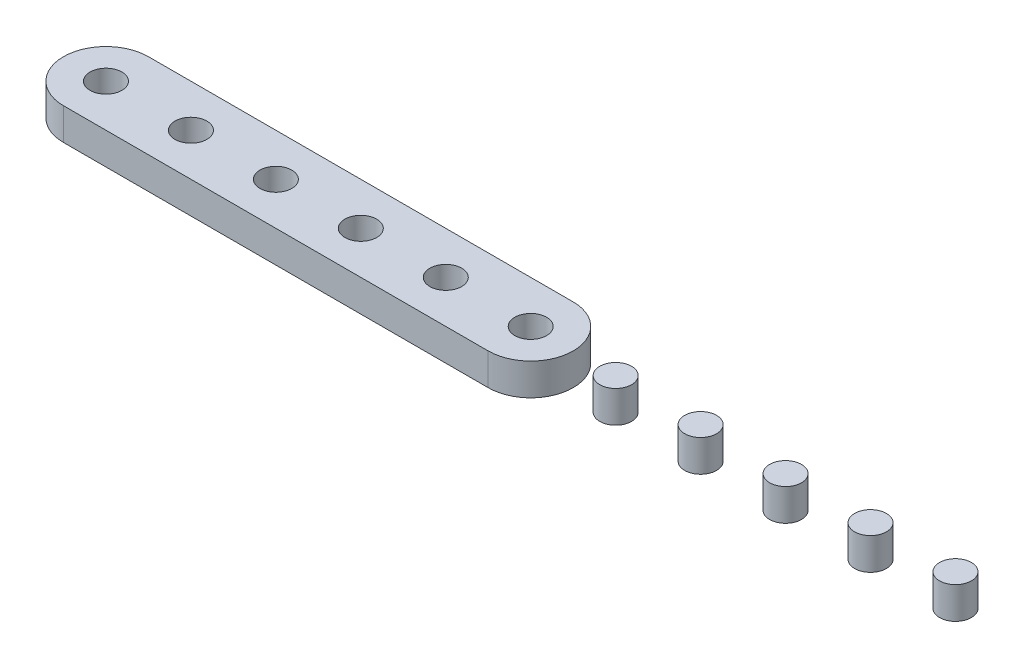
ISO-10303-21;
HEADER;
FILE_DESCRIPTION(('STEP AP214'),'2;1');
FILE_NAME('part.step','',(''),(''),'','','');
FILE_SCHEMA(('AUTOMOTIVE_DESIGN { 1 0 10303 214 1 1 1 1 }'));
ENDSEC;
DATA;
#1=APPLICATION_CONTEXT('core data for automotive mechanical design processes');
#2=APPLICATION_PROTOCOL_DEFINITION('international standard','automotive_design',2000,#1);
#3=PRODUCT_CONTEXT('',#1,'mechanical');
#4=PRODUCT('Part','Part','',(#3));
#5=PRODUCT_RELATED_PRODUCT_CATEGORY('part','',(#4));
#6=PRODUCT_DEFINITION_FORMATION('','',#4);
#7=PRODUCT_DEFINITION_CONTEXT('part definition',#1,'design');
#8=PRODUCT_DEFINITION('design','',#6,#7);
#9=PRODUCT_DEFINITION_SHAPE('','',#8);
#10=(LENGTH_UNIT() NAMED_UNIT(*) SI_UNIT(.MILLI.,.METRE.));
#11=(NAMED_UNIT(*) PLANE_ANGLE_UNIT() SI_UNIT($,.RADIAN.));
#12=(NAMED_UNIT(*) SI_UNIT($,.STERADIAN.) SOLID_ANGLE_UNIT());
#13=UNCERTAINTY_MEASURE_WITH_UNIT(LENGTH_MEASURE(1.E-05),#10,'distance_accuracy_value','');
#14=(GEOMETRIC_REPRESENTATION_CONTEXT(3) GLOBAL_UNCERTAINTY_ASSIGNED_CONTEXT((#13)) GLOBAL_UNIT_ASSIGNED_CONTEXT((#10,
#11,#12)) REPRESENTATION_CONTEXT('',''));
#15=CARTESIAN_POINT('',(0.,0.,0.));
#16=DIRECTION('',(0.,0.,1.));
#17=DIRECTION('',(1.,0.,0.));
#18=AXIS2_PLACEMENT_3D('',#15,#16,#17);
#19=CARTESIAN_POINT('',(80.,3.,0.));
#20=DIRECTION('',(0.,-1.,0.));
#21=DIRECTION('',(0.,0.,-1.));
#22=AXIS2_PLACEMENT_3D('',#19,#20,#21);
#23=CYLINDRICAL_SURFACE('',#22,1.5);
#24=CARTESIAN_POINT('',(80.,3.,0.));
#25=DIRECTION('',(0.,1.,0.));
#26=DIRECTION('',(0.,0.,1.));
#27=AXIS2_PLACEMENT_3D('',#24,#25,#26);
#28=CIRCLE('',#27,1.5);
#29=CARTESIAN_POINT('',(80.,3.,1.5));
#30=VERTEX_POINT('',#29);
#31=EDGE_CURVE('E11',#30,#30,#28,.T.);
#32=ORIENTED_EDGE('',*,*,#31,.F.);
#33=EDGE_LOOP('',(#32));
#34=FACE_BOUND('',#33,.T.);
#35=CARTESIAN_POINT('',(80.,0.,0.));
#36=DIRECTION('',(0.,1.,0.));
#37=DIRECTION('',(0.,0.,1.));
#38=AXIS2_PLACEMENT_3D('',#35,#36,#37);
#39=CIRCLE('',#38,1.5);
#40=CARTESIAN_POINT('',(80.,0.,1.5));
#41=VERTEX_POINT('',#40);
#42=EDGE_CURVE('E43',#41,#41,#39,.T.);
#43=ORIENTED_EDGE('',*,*,#42,.T.);
#44=EDGE_LOOP('',(#43));
#45=FACE_BOUND('',#44,.T.);
#46=ADVANCED_FACE('F40',(#34,#45),#23,.T.);
#47=CARTESIAN_POINT('',(80.,3.,0.));
#48=DIRECTION('',(0.,1.,0.));
#49=DIRECTION('',(0.,0.,1.));
#50=AXIS2_PLACEMENT_3D('',#47,#48,#49);
#51=PLANE('',#50);
#52=ORIENTED_EDGE('',*,*,#31,.T.);
#53=EDGE_LOOP('',(#52));
#54=FACE_BOUND('',#53,.T.);
#55=ADVANCED_FACE('F55',(#54),#51,.T.);
#56=CARTESIAN_POINT('',(80.,0.,0.));
#57=DIRECTION('',(0.,1.,0.));
#58=DIRECTION('',(0.,0.,1.));
#59=AXIS2_PLACEMENT_3D('',#56,#57,#58);
#60=PLANE('',#59);
#61=ORIENTED_EDGE('',*,*,#42,.F.);
#62=EDGE_LOOP('',(#61));
#63=FACE_BOUND('',#62,.T.);
#64=ADVANCED_FACE('F53',(#63),#60,.F.);
#65=CLOSED_SHELL('',(#46,#55,#64));
#66=MANIFOLD_SOLID_BREP('B2',#65);
#67=CARTESIAN_POINT('',(72.,3.,0.));
#68=DIRECTION('',(0.,-1.,0.));
#69=DIRECTION('',(0.,0.,-1.));
#70=AXIS2_PLACEMENT_3D('',#67,#68,#69);
#71=CYLINDRICAL_SURFACE('',#70,1.5);
#72=CARTESIAN_POINT('',(72.,3.,0.));
#73=DIRECTION('',(0.,1.,0.));
#74=DIRECTION('',(0.,0.,1.));
#75=AXIS2_PLACEMENT_3D('',#72,#73,#74);
#76=CIRCLE('',#75,1.5);
#77=CARTESIAN_POINT('',(72.,3.,1.5));
#78=VERTEX_POINT('',#77);
#79=EDGE_CURVE('E39',#78,#78,#76,.T.);
#80=ORIENTED_EDGE('',*,*,#79,.F.);
#81=EDGE_LOOP('',(#80));
#82=FACE_BOUND('',#81,.T.);
#83=CARTESIAN_POINT('',(72.,0.,0.));
#84=DIRECTION('',(0.,1.,0.));
#85=DIRECTION('',(0.,0.,1.));
#86=AXIS2_PLACEMENT_3D('',#83,#84,#85);
#87=CIRCLE('',#86,1.5);
#88=CARTESIAN_POINT('',(72.,0.,1.5));
#89=VERTEX_POINT('',#88);
#90=EDGE_CURVE('E92',#89,#89,#87,.T.);
#91=ORIENTED_EDGE('',*,*,#90,.T.);
#92=EDGE_LOOP('',(#91));
#93=FACE_BOUND('',#92,.T.);
#94=ADVANCED_FACE('F89',(#82,#93),#71,.T.);
#95=CARTESIAN_POINT('',(72.,3.,0.));
#96=DIRECTION('',(0.,1.,0.));
#97=DIRECTION('',(0.,0.,1.));
#98=AXIS2_PLACEMENT_3D('',#95,#96,#97);
#99=PLANE('',#98);
#100=ORIENTED_EDGE('',*,*,#79,.T.);
#101=EDGE_LOOP('',(#100));
#102=FACE_BOUND('',#101,.T.);
#103=ADVANCED_FACE('F104',(#102),#99,.T.);
#104=CARTESIAN_POINT('',(72.,0.,0.));
#105=DIRECTION('',(0.,1.,0.));
#106=DIRECTION('',(0.,0.,1.));
#107=AXIS2_PLACEMENT_3D('',#104,#105,#106);
#108=PLANE('',#107);
#109=ORIENTED_EDGE('',*,*,#90,.F.);
#110=EDGE_LOOP('',(#109));
#111=FACE_BOUND('',#110,.T.);
#112=ADVANCED_FACE('F102',(#111),#108,.F.);
#113=CLOSED_SHELL('',(#94,#103,#112));
#114=MANIFOLD_SOLID_BREP('B6',#113);
#115=CARTESIAN_POINT('',(64.,3.,0.));
#116=DIRECTION('',(0.,-1.,0.));
#117=DIRECTION('',(0.,0.,-1.));
#118=AXIS2_PLACEMENT_3D('',#115,#116,#117);
#119=CYLINDRICAL_SURFACE('',#118,1.5);
#120=CARTESIAN_POINT('',(64.,3.,0.));
#121=DIRECTION('',(0.,1.,0.));
#122=DIRECTION('',(0.,0.,1.));
#123=AXIS2_PLACEMENT_3D('',#120,#121,#122);
#124=CIRCLE('',#123,1.5);
#125=CARTESIAN_POINT('',(64.,3.,1.5));
#126=VERTEX_POINT('',#125);
#127=EDGE_CURVE('E88',#126,#126,#124,.T.);
#128=ORIENTED_EDGE('',*,*,#127,.F.);
#129=EDGE_LOOP('',(#128));
#130=FACE_BOUND('',#129,.T.);
#131=CARTESIAN_POINT('',(64.,0.,0.));
#132=DIRECTION('',(0.,1.,0.));
#133=DIRECTION('',(0.,0.,1.));
#134=AXIS2_PLACEMENT_3D('',#131,#132,#133);
#135=CIRCLE('',#134,1.5);
#136=CARTESIAN_POINT('',(64.,0.,1.5));
#137=VERTEX_POINT('',#136);
#138=EDGE_CURVE('E141',#137,#137,#135,.T.);
#139=ORIENTED_EDGE('',*,*,#138,.T.);
#140=EDGE_LOOP('',(#139));
#141=FACE_BOUND('',#140,.T.);
#142=ADVANCED_FACE('F138',(#130,#141),#119,.T.);
#143=CARTESIAN_POINT('',(64.,3.,0.));
#144=DIRECTION('',(0.,1.,0.));
#145=DIRECTION('',(0.,0.,1.));
#146=AXIS2_PLACEMENT_3D('',#143,#144,#145);
#147=PLANE('',#146);
#148=ORIENTED_EDGE('',*,*,#127,.T.);
#149=EDGE_LOOP('',(#148));
#150=FACE_BOUND('',#149,.T.);
#151=ADVANCED_FACE('F153',(#150),#147,.T.);
#152=CARTESIAN_POINT('',(64.,0.,0.));
#153=DIRECTION('',(0.,1.,0.));
#154=DIRECTION('',(0.,0.,1.));
#155=AXIS2_PLACEMENT_3D('',#152,#153,#154);
#156=PLANE('',#155);
#157=ORIENTED_EDGE('',*,*,#138,.F.);
#158=EDGE_LOOP('',(#157));
#159=FACE_BOUND('',#158,.T.);
#160=ADVANCED_FACE('F151',(#159),#156,.F.);
#161=CLOSED_SHELL('',(#142,#151,#160));
#162=MANIFOLD_SOLID_BREP('B34',#161);
#163=CARTESIAN_POINT('',(56.,3.,0.));
#164=DIRECTION('',(0.,-1.,0.));
#165=DIRECTION('',(0.,0.,-1.));
#166=AXIS2_PLACEMENT_3D('',#163,#164,#165);
#167=CYLINDRICAL_SURFACE('',#166,1.5);
#168=CARTESIAN_POINT('',(56.,3.,0.));
#169=DIRECTION('',(0.,1.,0.));
#170=DIRECTION('',(0.,0.,1.));
#171=AXIS2_PLACEMENT_3D('',#168,#169,#170);
#172=CIRCLE('',#171,1.5);
#173=CARTESIAN_POINT('',(56.,3.,1.5));
#174=VERTEX_POINT('',#173);
#175=EDGE_CURVE('E137',#174,#174,#172,.T.);
#176=ORIENTED_EDGE('',*,*,#175,.F.);
#177=EDGE_LOOP('',(#176));
#178=FACE_BOUND('',#177,.T.);
#179=CARTESIAN_POINT('',(56.,0.,0.));
#180=DIRECTION('',(0.,1.,0.));
#181=DIRECTION('',(0.,0.,1.));
#182=AXIS2_PLACEMENT_3D('',#179,#180,#181);
#183=CIRCLE('',#182,1.5);
#184=CARTESIAN_POINT('',(56.,0.,1.5));
#185=VERTEX_POINT('',#184);
#186=EDGE_CURVE('E190',#185,#185,#183,.T.);
#187=ORIENTED_EDGE('',*,*,#186,.T.);
#188=EDGE_LOOP('',(#187));
#189=FACE_BOUND('',#188,.T.);
#190=ADVANCED_FACE('F187',(#178,#189),#167,.T.);
#191=CARTESIAN_POINT('',(56.,3.,0.));
#192=DIRECTION('',(0.,1.,0.));
#193=DIRECTION('',(0.,0.,1.));
#194=AXIS2_PLACEMENT_3D('',#191,#192,#193);
#195=PLANE('',#194);
#196=ORIENTED_EDGE('',*,*,#175,.T.);
#197=EDGE_LOOP('',(#196));
#198=FACE_BOUND('',#197,.T.);
#199=ADVANCED_FACE('F202',(#198),#195,.T.);
#200=CARTESIAN_POINT('',(56.,0.,0.));
#201=DIRECTION('',(0.,1.,0.));
#202=DIRECTION('',(0.,0.,1.));
#203=AXIS2_PLACEMENT_3D('',#200,#201,#202);
#204=PLANE('',#203);
#205=ORIENTED_EDGE('',*,*,#186,.F.);
#206=EDGE_LOOP('',(#205));
#207=FACE_BOUND('',#206,.T.);
#208=ADVANCED_FACE('F200',(#207),#204,.F.);
#209=CLOSED_SHELL('',(#190,#199,#208));
#210=MANIFOLD_SOLID_BREP('B83',#209);
#211=CARTESIAN_POINT('',(48.,3.,0.));
#212=DIRECTION('',(0.,-1.,0.));
#213=DIRECTION('',(0.,0.,-1.));
#214=AXIS2_PLACEMENT_3D('',#211,#212,#213);
#215=CYLINDRICAL_SURFACE('',#214,1.5);
#216=CARTESIAN_POINT('',(48.,3.,0.));
#217=DIRECTION('',(0.,1.,0.));
#218=DIRECTION('',(0.,0.,1.));
#219=AXIS2_PLACEMENT_3D('',#216,#217,#218);
#220=CIRCLE('',#219,1.5);
#221=CARTESIAN_POINT('',(48.,3.,1.5));
#222=VERTEX_POINT('',#221);
#223=EDGE_CURVE('E186',#222,#222,#220,.T.);
#224=ORIENTED_EDGE('',*,*,#223,.F.);
#225=EDGE_LOOP('',(#224));
#226=FACE_BOUND('',#225,.T.);
#227=CARTESIAN_POINT('',(48.,0.,0.));
#228=DIRECTION('',(0.,1.,0.));
#229=DIRECTION('',(0.,0.,1.));
#230=AXIS2_PLACEMENT_3D('',#227,#228,#229);
#231=CIRCLE('',#230,1.5);
#232=CARTESIAN_POINT('',(48.,0.,1.5));
#233=VERTEX_POINT('',#232);
#234=EDGE_CURVE('E240',#233,#233,#231,.T.);
#235=ORIENTED_EDGE('',*,*,#234,.T.);
#236=EDGE_LOOP('',(#235));
#237=FACE_BOUND('',#236,.T.);
#238=ADVANCED_FACE('F237',(#226,#237),#215,.T.);
#239=CARTESIAN_POINT('',(48.,3.,0.));
#240=DIRECTION('',(0.,1.,0.));
#241=DIRECTION('',(0.,0.,1.));
#242=AXIS2_PLACEMENT_3D('',#239,#240,#241);
#243=PLANE('',#242);
#244=ORIENTED_EDGE('',*,*,#223,.T.);
#245=EDGE_LOOP('',(#244));
#246=FACE_BOUND('',#245,.T.);
#247=ADVANCED_FACE('F252',(#246),#243,.T.);
#248=CARTESIAN_POINT('',(48.,0.,0.));
#249=DIRECTION('',(0.,1.,0.));
#250=DIRECTION('',(0.,0.,1.));
#251=AXIS2_PLACEMENT_3D('',#248,#249,#250);
#252=PLANE('',#251);
#253=ORIENTED_EDGE('',*,*,#234,.F.);
#254=EDGE_LOOP('',(#253));
#255=FACE_BOUND('',#254,.T.);
#256=ADVANCED_FACE('F250',(#255),#252,.F.);
#257=CLOSED_SHELL('',(#238,#247,#256));
#258=MANIFOLD_SOLID_BREP('B132',#257);
#259=CARTESIAN_POINT('',(0.,3.,0.));
#260=DIRECTION('',(0.,1.,0.));
#261=DIRECTION('',(0.,0.,1.));
#262=AXIS2_PLACEMENT_3D('',#259,#260,#261);
#263=PLANE('',#262);
#264=CARTESIAN_POINT('',(32.,3.,0.));
#265=DIRECTION('',(0.,1.,0.));
#266=DIRECTION('',(0.,0.,1.));
#267=AXIS2_PLACEMENT_3D('',#264,#265,#266);
#268=CIRCLE('',#267,1.5);
#269=CARTESIAN_POINT('',(32.,3.,1.5));
#270=VERTEX_POINT('',#269);
#271=EDGE_CURVE('E378',#270,#270,#268,.T.);
#272=ORIENTED_EDGE('',*,*,#271,.F.);
#273=EDGE_LOOP('',(#272));
#274=FACE_BOUND('',#273,.T.);
#275=CARTESIAN_POINT('',(16.,3.,0.));
#276=DIRECTION('',(0.,1.,0.));
#277=DIRECTION('',(0.,0.,1.));
#278=AXIS2_PLACEMENT_3D('',#275,#276,#277);
#279=CIRCLE('',#278,1.5);
#280=CARTESIAN_POINT('',(16.,3.,1.5));
#281=VERTEX_POINT('',#280);
#282=EDGE_CURVE('E366',#281,#281,#279,.T.);
#283=ORIENTED_EDGE('',*,*,#282,.F.);
#284=EDGE_LOOP('',(#283));
#285=FACE_BOUND('',#284,.T.);
#286=CARTESIAN_POINT('',(0.,3.,0.));
#287=DIRECTION('',(0.,1.,0.));
#288=DIRECTION('',(0.,0.,1.));
#289=AXIS2_PLACEMENT_3D('',#286,#287,#288);
#290=CIRCLE('',#289,1.5);
#291=CARTESIAN_POINT('',(0.,3.,1.5));
#292=VERTEX_POINT('',#291);
#293=EDGE_CURVE('E345',#292,#292,#290,.T.);
#294=ORIENTED_EDGE('',*,*,#293,.F.);
#295=EDGE_LOOP('',(#294));
#296=FACE_BOUND('',#295,.T.);
#297=CARTESIAN_POINT('',(0.,3.,0.));
#298=DIRECTION('',(0.,1.,0.));
#299=DIRECTION('',(0.,0.,1.));
#300=AXIS2_PLACEMENT_3D('',#297,#298,#299);
#301=CIRCLE('',#300,4.);
#302=CARTESIAN_POINT('',(0.,3.,-4.));
#303=VERTEX_POINT('',#302);
#304=CARTESIAN_POINT('',(0.,3.,4.));
#305=VERTEX_POINT('',#304);
#306=EDGE_CURVE('E330',#303,#305,#301,.T.);
#307=ORIENTED_EDGE('',*,*,#306,.T.);
#308=DIRECTION('',(1.,0.,0.));
#309=VECTOR('',#308,1.);
#310=CARTESIAN_POINT('',(0.,3.,4.));
#311=LINE('',#310,#309);
#312=CARTESIAN_POINT('',(40.,3.,4.));
#313=VERTEX_POINT('',#312);
#314=EDGE_CURVE('E325',#305,#313,#311,.T.);
#315=ORIENTED_EDGE('',*,*,#314,.T.);
#316=CARTESIAN_POINT('',(40.,3.,0.));
#317=DIRECTION('',(0.,1.,0.));
#318=DIRECTION('',(0.,0.,1.));
#319=AXIS2_PLACEMENT_3D('',#316,#317,#318);
#320=CIRCLE('',#319,4.);
#321=CARTESIAN_POINT('',(40.,3.,-4.));
#322=VERTEX_POINT('',#321);
#323=EDGE_CURVE('E328',#313,#322,#320,.T.);
#324=ORIENTED_EDGE('',*,*,#323,.T.);
#325=DIRECTION('',(-1.,0.,0.));
#326=VECTOR('',#325,1.);
#327=CARTESIAN_POINT('',(0.,3.,-4.));
#328=LINE('',#327,#326);
#329=EDGE_CURVE('E295',#322,#303,#328,.T.);
#330=ORIENTED_EDGE('',*,*,#329,.T.);
#331=EDGE_LOOP('',(#307,#315,#324,#330));
#332=FACE_BOUND('',#331,.T.);
#333=CARTESIAN_POINT('',(8.,3.,0.));
#334=DIRECTION('',(0.,1.,0.));
#335=DIRECTION('',(0.,0.,1.));
#336=AXIS2_PLACEMENT_3D('',#333,#334,#335);
#337=CIRCLE('',#336,1.5);
#338=CARTESIAN_POINT('',(8.,3.,1.5));
#339=VERTEX_POINT('',#338);
#340=EDGE_CURVE('E360',#339,#339,#337,.T.);
#341=ORIENTED_EDGE('',*,*,#340,.F.);
#342=EDGE_LOOP('',(#341));
#343=FACE_BOUND('',#342,.T.);
#344=CARTESIAN_POINT('',(24.,3.,0.));
#345=DIRECTION('',(0.,1.,0.));
#346=DIRECTION('',(0.,0.,1.));
#347=AXIS2_PLACEMENT_3D('',#344,#345,#346);
#348=CIRCLE('',#347,1.5);
#349=CARTESIAN_POINT('',(24.,3.,1.5));
#350=VERTEX_POINT('',#349);
#351=EDGE_CURVE('E372',#350,#350,#348,.T.);
#352=ORIENTED_EDGE('',*,*,#351,.F.);
#353=EDGE_LOOP('',(#352));
#354=FACE_BOUND('',#353,.T.);
#355=CARTESIAN_POINT('',(40.,3.,0.));
#356=DIRECTION('',(0.,1.,0.));
#357=DIRECTION('',(0.,0.,1.));
#358=AXIS2_PLACEMENT_3D('',#355,#356,#357);
#359=CIRCLE('',#358,1.5);
#360=CARTESIAN_POINT('',(40.,3.,1.5));
#361=VERTEX_POINT('',#360);
#362=EDGE_CURVE('E384',#361,#361,#359,.T.);
#363=ORIENTED_EDGE('',*,*,#362,.F.);
#364=EDGE_LOOP('',(#363));
#365=FACE_BOUND('',#364,.T.);
#366=ADVANCED_FACE('F278',(#274,#285,#296,#332,#343,#354,#365),#263,.T.);
#367=CARTESIAN_POINT('',(0.,0.,0.));
#368=DIRECTION('',(0.,1.,0.));
#369=DIRECTION('',(0.,0.,1.));
#370=AXIS2_PLACEMENT_3D('',#367,#368,#369);
#371=PLANE('',#370);
#372=CARTESIAN_POINT('',(32.,0.,0.));
#373=DIRECTION('',(0.,1.,0.));
#374=DIRECTION('',(0.,0.,1.));
#375=AXIS2_PLACEMENT_3D('',#372,#373,#374);
#376=CIRCLE('',#375,1.5);
#377=CARTESIAN_POINT('',(32.,0.,1.5));
#378=VERTEX_POINT('',#377);
#379=EDGE_CURVE('E381',#378,#378,#376,.T.);
#380=ORIENTED_EDGE('',*,*,#379,.T.);
#381=EDGE_LOOP('',(#380));
#382=FACE_BOUND('',#381,.T.);
#383=CARTESIAN_POINT('',(16.,0.,0.));
#384=DIRECTION('',(0.,1.,0.));
#385=DIRECTION('',(0.,0.,1.));
#386=AXIS2_PLACEMENT_3D('',#383,#384,#385);
#387=CIRCLE('',#386,1.5);
#388=CARTESIAN_POINT('',(16.,0.,1.5));
#389=VERTEX_POINT('',#388);
#390=EDGE_CURVE('E369',#389,#389,#387,.T.);
#391=ORIENTED_EDGE('',*,*,#390,.T.);
#392=EDGE_LOOP('',(#391));
#393=FACE_BOUND('',#392,.T.);
#394=CARTESIAN_POINT('',(0.,0.,0.));
#395=DIRECTION('',(0.,1.,0.));
#396=DIRECTION('',(0.,0.,1.));
#397=AXIS2_PLACEMENT_3D('',#394,#395,#396);
#398=CIRCLE('',#397,1.5);
#399=CARTESIAN_POINT('',(0.,0.,1.5));
#400=VERTEX_POINT('',#399);
#401=EDGE_CURVE('E357',#400,#400,#398,.T.);
#402=ORIENTED_EDGE('',*,*,#401,.T.);
#403=EDGE_LOOP('',(#402));
#404=FACE_BOUND('',#403,.T.);
#405=CARTESIAN_POINT('',(0.,0.,0.));
#406=DIRECTION('',(0.,1.,0.));
#407=DIRECTION('',(0.,0.,1.));
#408=AXIS2_PLACEMENT_3D('',#405,#406,#407);
#409=CIRCLE('',#408,4.);
#410=CARTESIAN_POINT('',(0.,0.,-4.));
#411=VERTEX_POINT('',#410);
#412=CARTESIAN_POINT('',(0.,0.,4.));
#413=VERTEX_POINT('',#412);
#414=EDGE_CURVE('E342',#411,#413,#409,.T.);
#415=ORIENTED_EDGE('',*,*,#414,.F.);
#416=DIRECTION('',(-1.,0.,0.));
#417=VECTOR('',#416,1.);
#418=CARTESIAN_POINT('',(0.,0.,-4.));
#419=LINE('',#418,#417);
#420=CARTESIAN_POINT('',(40.,0.,-4.));
#421=VERTEX_POINT('',#420);
#422=EDGE_CURVE('E318',#421,#411,#419,.T.);
#423=ORIENTED_EDGE('',*,*,#422,.F.);
#424=CARTESIAN_POINT('',(40.,0.,0.));
#425=DIRECTION('',(0.,1.,0.));
#426=DIRECTION('',(0.,0.,1.));
#427=AXIS2_PLACEMENT_3D('',#424,#425,#426);
#428=CIRCLE('',#427,4.);
#429=CARTESIAN_POINT('',(40.,0.,4.));
#430=VERTEX_POINT('',#429);
#431=EDGE_CURVE('E312',#430,#421,#428,.T.);
#432=ORIENTED_EDGE('',*,*,#431,.F.);
#433=DIRECTION('',(1.,0.,0.));
#434=VECTOR('',#433,1.);
#435=CARTESIAN_POINT('',(0.,0.,4.));
#436=LINE('',#435,#434);
#437=EDGE_CURVE('E334',#413,#430,#436,.T.);
#438=ORIENTED_EDGE('',*,*,#437,.F.);
#439=EDGE_LOOP('',(#415,#423,#432,#438));
#440=FACE_BOUND('',#439,.T.);
#441=CARTESIAN_POINT('',(8.,0.,0.));
#442=DIRECTION('',(0.,1.,0.));
#443=DIRECTION('',(0.,0.,1.));
#444=AXIS2_PLACEMENT_3D('',#441,#442,#443);
#445=CIRCLE('',#444,1.5);
#446=CARTESIAN_POINT('',(8.,0.,1.5));
#447=VERTEX_POINT('',#446);
#448=EDGE_CURVE('E363',#447,#447,#445,.T.);
#449=ORIENTED_EDGE('',*,*,#448,.T.);
#450=EDGE_LOOP('',(#449));
#451=FACE_BOUND('',#450,.T.);
#452=CARTESIAN_POINT('',(24.,0.,0.));
#453=DIRECTION('',(0.,1.,0.));
#454=DIRECTION('',(0.,0.,1.));
#455=AXIS2_PLACEMENT_3D('',#452,#453,#454);
#456=CIRCLE('',#455,1.5);
#457=CARTESIAN_POINT('',(24.,0.,1.5));
#458=VERTEX_POINT('',#457);
#459=EDGE_CURVE('E375',#458,#458,#456,.T.);
#460=ORIENTED_EDGE('',*,*,#459,.T.);
#461=EDGE_LOOP('',(#460));
#462=FACE_BOUND('',#461,.T.);
#463=CARTESIAN_POINT('',(40.,0.,0.));
#464=DIRECTION('',(0.,1.,0.));
#465=DIRECTION('',(0.,0.,1.));
#466=AXIS2_PLACEMENT_3D('',#463,#464,#465);
#467=CIRCLE('',#466,1.5);
#468=CARTESIAN_POINT('',(40.,0.,1.5));
#469=VERTEX_POINT('',#468);
#470=EDGE_CURVE('E387',#469,#469,#467,.T.);
#471=ORIENTED_EDGE('',*,*,#470,.T.);
#472=EDGE_LOOP('',(#471));
#473=FACE_BOUND('',#472,.T.);
#474=ADVANCED_FACE('F353',(#382,#393,#404,#440,#451,#462,#473),#371,.F.);
#475=CARTESIAN_POINT('',(0.,3.,0.));
#476=DIRECTION('',(0.,-1.,0.));
#477=DIRECTION('',(0.,0.,-1.));
#478=AXIS2_PLACEMENT_3D('',#475,#476,#477);
#479=CYLINDRICAL_SURFACE('',#478,4.);
#480=ORIENTED_EDGE('',*,*,#414,.T.);
#481=DIRECTION('',(0.,-1.,0.));
#482=VECTOR('',#481,1.);
#483=CARTESIAN_POINT('',(0.,3.,4.));
#484=LINE('',#483,#482);
#485=EDGE_CURVE('E235',#305,#413,#484,.T.);
#486=ORIENTED_EDGE('',*,*,#485,.F.);
#487=ORIENTED_EDGE('',*,*,#306,.F.);
#488=DIRECTION('',(0.,-1.,0.));
#489=VECTOR('',#488,1.);
#490=CARTESIAN_POINT('',(0.,3.,-4.));
#491=LINE('',#490,#489);
#492=EDGE_CURVE('E338',#303,#411,#491,.T.);
#493=ORIENTED_EDGE('',*,*,#492,.T.);
#494=EDGE_LOOP('',(#480,#486,#487,#493));
#495=FACE_BOUND('',#494,.T.);
#496=ADVANCED_FACE('F280',(#495),#479,.T.);
#497=CARTESIAN_POINT('',(0.,3.,4.));
#498=DIRECTION('',(0.,0.,-1.));
#499=DIRECTION('',(-1.,0.,0.));
#500=AXIS2_PLACEMENT_3D('',#497,#498,#499);
#501=PLANE('',#500);
#502=ORIENTED_EDGE('',*,*,#437,.T.);
#503=DIRECTION('',(0.,-1.,0.));
#504=VECTOR('',#503,1.);
#505=CARTESIAN_POINT('',(40.,3.,4.));
#506=LINE('',#505,#504);
#507=EDGE_CURVE('E287',#313,#430,#506,.T.);
#508=ORIENTED_EDGE('',*,*,#507,.F.);
#509=ORIENTED_EDGE('',*,*,#314,.F.);
#510=ORIENTED_EDGE('',*,*,#485,.T.);
#511=EDGE_LOOP('',(#502,#508,#509,#510));
#512=FACE_BOUND('',#511,.T.);
#513=ADVANCED_FACE('F333',(#512),#501,.F.);
#514=CARTESIAN_POINT('',(40.,3.,0.));
#515=DIRECTION('',(0.,-1.,0.));
#516=DIRECTION('',(0.,0.,-1.));
#517=AXIS2_PLACEMENT_3D('',#514,#515,#516);
#518=CYLINDRICAL_SURFACE('',#517,4.);
#519=ORIENTED_EDGE('',*,*,#431,.T.);
#520=DIRECTION('',(0.,-1.,0.));
#521=VECTOR('',#520,1.);
#522=CARTESIAN_POINT('',(40.,3.,-4.));
#523=LINE('',#522,#521);
#524=EDGE_CURVE('E335',#322,#421,#523,.T.);
#525=ORIENTED_EDGE('',*,*,#524,.F.);
#526=ORIENTED_EDGE('',*,*,#323,.F.);
#527=ORIENTED_EDGE('',*,*,#507,.T.);
#528=EDGE_LOOP('',(#519,#525,#526,#527));
#529=FACE_BOUND('',#528,.T.);
#530=ADVANCED_FACE('F336',(#529),#518,.T.);
#531=CARTESIAN_POINT('',(0.,3.,-4.));
#532=DIRECTION('',(0.,0.,1.));
#533=DIRECTION('',(1.,0.,0.));
#534=AXIS2_PLACEMENT_3D('',#531,#532,#533);
#535=PLANE('',#534);
#536=ORIENTED_EDGE('',*,*,#422,.T.);
#537=ORIENTED_EDGE('',*,*,#492,.F.);
#538=ORIENTED_EDGE('',*,*,#329,.F.);
#539=ORIENTED_EDGE('',*,*,#524,.T.);
#540=EDGE_LOOP('',(#536,#537,#538,#539));
#541=FACE_BOUND('',#540,.T.);
#542=ADVANCED_FACE('F350',(#541),#535,.F.);
#543=CARTESIAN_POINT('',(0.,3.,0.));
#544=DIRECTION('',(0.,-1.,0.));
#545=DIRECTION('',(0.,0.,-1.));
#546=AXIS2_PLACEMENT_3D('',#543,#544,#545);
#547=CYLINDRICAL_SURFACE('',#546,1.5);
#548=ORIENTED_EDGE('',*,*,#293,.T.);
#549=EDGE_LOOP('',(#548));
#550=FACE_BOUND('',#549,.T.);
#551=ORIENTED_EDGE('',*,*,#401,.F.);
#552=EDGE_LOOP('',(#551));
#553=FACE_BOUND('',#552,.T.);
#554=ADVANCED_FACE('F407',(#550,#553),#547,.F.);
#555=CARTESIAN_POINT('',(8.,3.,0.));
#556=DIRECTION('',(0.,-1.,0.));
#557=DIRECTION('',(0.,0.,-1.));
#558=AXIS2_PLACEMENT_3D('',#555,#556,#557);
#559=CYLINDRICAL_SURFACE('',#558,1.5);
#560=ORIENTED_EDGE('',*,*,#340,.T.);
#561=EDGE_LOOP('',(#560));
#562=FACE_BOUND('',#561,.T.);
#563=ORIENTED_EDGE('',*,*,#448,.F.);
#564=EDGE_LOOP('',(#563));
#565=FACE_BOUND('',#564,.T.);
#566=ADVANCED_FACE('F453',(#562,#565),#559,.F.);
#567=CARTESIAN_POINT('',(16.,3.,0.));
#568=DIRECTION('',(0.,-1.,0.));
#569=DIRECTION('',(0.,0.,-1.));
#570=AXIS2_PLACEMENT_3D('',#567,#568,#569);
#571=CYLINDRICAL_SURFACE('',#570,1.5);
#572=ORIENTED_EDGE('',*,*,#282,.T.);
#573=EDGE_LOOP('',(#572));
#574=FACE_BOUND('',#573,.T.);
#575=ORIENTED_EDGE('',*,*,#390,.F.);
#576=EDGE_LOOP('',(#575));
#577=FACE_BOUND('',#576,.T.);
#578=ADVANCED_FACE('F461',(#574,#577),#571,.F.);
#579=CARTESIAN_POINT('',(24.,3.,0.));
#580=DIRECTION('',(0.,-1.,0.));
#581=DIRECTION('',(0.,0.,-1.));
#582=AXIS2_PLACEMENT_3D('',#579,#580,#581);
#583=CYLINDRICAL_SURFACE('',#582,1.5);
#584=ORIENTED_EDGE('',*,*,#351,.T.);
#585=EDGE_LOOP('',(#584));
#586=FACE_BOUND('',#585,.T.);
#587=ORIENTED_EDGE('',*,*,#459,.F.);
#588=EDGE_LOOP('',(#587));
#589=FACE_BOUND('',#588,.T.);
#590=ADVANCED_FACE('F469',(#586,#589),#583,.F.);
#591=CARTESIAN_POINT('',(32.,3.,0.));
#592=DIRECTION('',(0.,-1.,0.));
#593=DIRECTION('',(0.,0.,-1.));
#594=AXIS2_PLACEMENT_3D('',#591,#592,#593);
#595=CYLINDRICAL_SURFACE('',#594,1.5);
#596=ORIENTED_EDGE('',*,*,#271,.T.);
#597=EDGE_LOOP('',(#596));
#598=FACE_BOUND('',#597,.T.);
#599=ORIENTED_EDGE('',*,*,#379,.F.);
#600=EDGE_LOOP('',(#599));
#601=FACE_BOUND('',#600,.T.);
#602=ADVANCED_FACE('F478',(#598,#601),#595,.F.);
#603=CARTESIAN_POINT('',(40.,3.,0.));
#604=DIRECTION('',(0.,-1.,0.));
#605=DIRECTION('',(0.,0.,-1.));
#606=AXIS2_PLACEMENT_3D('',#603,#604,#605);
#607=CYLINDRICAL_SURFACE('',#606,1.5);
#608=ORIENTED_EDGE('',*,*,#362,.T.);
#609=EDGE_LOOP('',(#608));
#610=FACE_BOUND('',#609,.T.);
#611=ORIENTED_EDGE('',*,*,#470,.F.);
#612=EDGE_LOOP('',(#611));
#613=FACE_BOUND('',#612,.T.);
#614=ADVANCED_FACE('F393',(#610,#613),#607,.F.);
#615=CLOSED_SHELL('',(#366,#474,#496,#513,#530,#542,#554,#566,#578,#590,#602,#614));
#616=MANIFOLD_SOLID_BREP('B181',#615);
#617=ADVANCED_BREP_SHAPE_REPRESENTATION('',(#18,#66,#114,#162,#210,#258,#616),#14);
#618=SHAPE_DEFINITION_REPRESENTATION(#9,#617);
ENDSEC;
END-ISO-10303-21;
